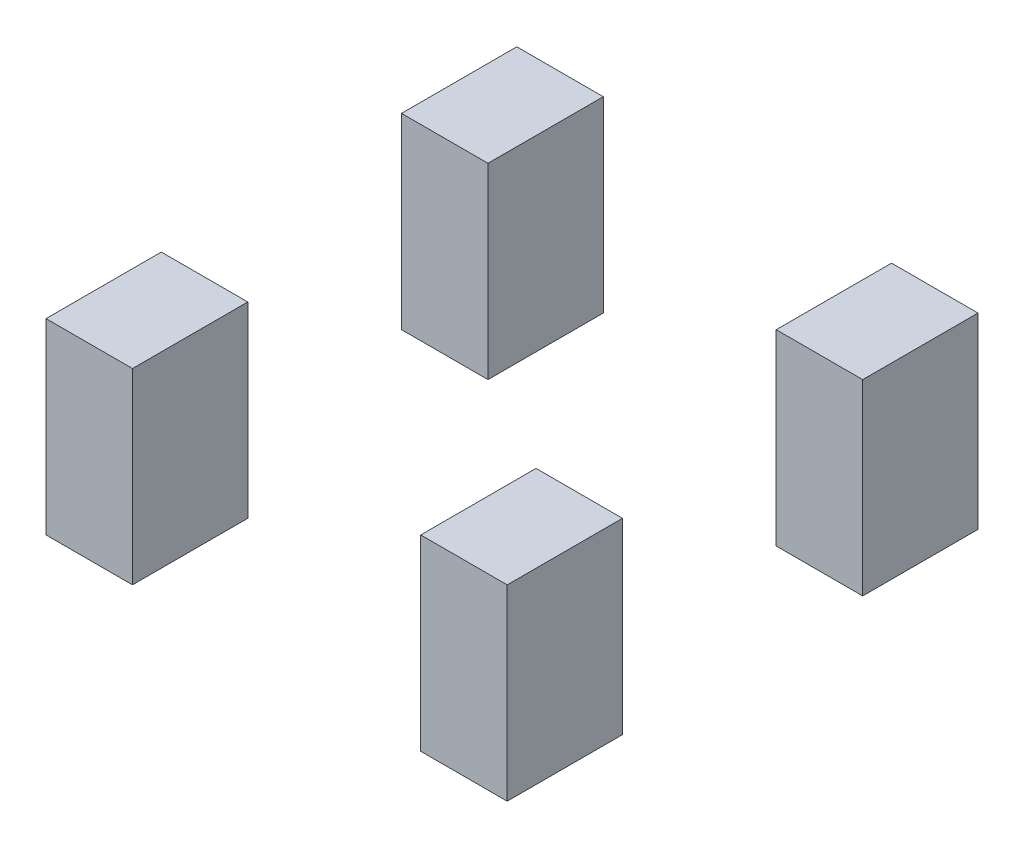
ISO-10303-21;
HEADER;
FILE_DESCRIPTION(('STEP AP214'),'2;1');
FILE_NAME('part.step','',(''),(''),'','','');
FILE_SCHEMA(('AUTOMOTIVE_DESIGN { 1 0 10303 214 1 1 1 1 }'));
ENDSEC;
DATA;
#1=APPLICATION_CONTEXT('core data for automotive mechanical design processes');
#2=APPLICATION_PROTOCOL_DEFINITION('international standard','automotive_design',2000,#1);
#3=PRODUCT_CONTEXT('',#1,'mechanical');
#4=PRODUCT('Part','Part','',(#3));
#5=PRODUCT_RELATED_PRODUCT_CATEGORY('part','',(#4));
#6=PRODUCT_DEFINITION_FORMATION('','',#4);
#7=PRODUCT_DEFINITION_CONTEXT('part definition',#1,'design');
#8=PRODUCT_DEFINITION('design','',#6,#7);
#9=PRODUCT_DEFINITION_SHAPE('','',#8);
#10=(LENGTH_UNIT() NAMED_UNIT(*) SI_UNIT(.MILLI.,.METRE.));
#11=(NAMED_UNIT(*) PLANE_ANGLE_UNIT() SI_UNIT($,.RADIAN.));
#12=(NAMED_UNIT(*) SI_UNIT($,.STERADIAN.) SOLID_ANGLE_UNIT());
#13=UNCERTAINTY_MEASURE_WITH_UNIT(LENGTH_MEASURE(1.E-05),#10,'distance_accuracy_value','');
#14=(GEOMETRIC_REPRESENTATION_CONTEXT(3) GLOBAL_UNCERTAINTY_ASSIGNED_CONTEXT((#13)) GLOBAL_UNIT_ASSIGNED_CONTEXT((#10,
#11,#12)) REPRESENTATION_CONTEXT('',''));
#15=CARTESIAN_POINT('',(0.,0.,0.));
#16=DIRECTION('',(0.,0.,1.));
#17=DIRECTION('',(1.,0.,0.));
#18=AXIS2_PLACEMENT_3D('',#15,#16,#17);
#19=CARTESIAN_POINT('',(-1234.81443298969,195.,5320.49405086318));
#20=DIRECTION('',(0.,0.,1.));
#21=DIRECTION('',(1.,0.,0.));
#22=AXIS2_PLACEMENT_3D('',#19,#20,#21);
#23=PLANE('',#22);
#24=DIRECTION('',(-1.,0.,0.));
#25=VECTOR('',#24,1.);
#26=CARTESIAN_POINT('',(-1234.81443298969,0.,5320.49405086318));
#27=LINE('',#26,#25);
#28=CARTESIAN_POINT('',(-1234.81443298969,0.,5320.49405086318));
#29=VERTEX_POINT('',#28);
#30=CARTESIAN_POINT('',(-1324.81443298969,0.,5320.49405086318));
#31=VERTEX_POINT('',#30);
#32=EDGE_CURVE('E108',#29,#31,#27,.T.);
#33=ORIENTED_EDGE('',*,*,#32,.T.);
#34=DIRECTION('',(0.,-1.,0.));
#35=VECTOR('',#34,1.);
#36=CARTESIAN_POINT('',(-1324.81443298969,195.,5320.49405086318));
#37=LINE('',#36,#35);
#38=CARTESIAN_POINT('',(-1324.81443298969,195.,5320.49405086318));
#39=VERTEX_POINT('',#38);
#40=EDGE_CURVE('E12',#39,#31,#37,.T.);
#41=ORIENTED_EDGE('',*,*,#40,.F.);
#42=DIRECTION('',(-1.,0.,0.));
#43=VECTOR('',#42,1.);
#44=CARTESIAN_POINT('',(-1234.81443298969,195.,5320.49405086318));
#45=LINE('',#44,#43);
#46=CARTESIAN_POINT('',(-1234.81443298969,195.,5320.49405086318));
#47=VERTEX_POINT('',#46);
#48=EDGE_CURVE('E96',#47,#39,#45,.T.);
#49=ORIENTED_EDGE('',*,*,#48,.F.);
#50=DIRECTION('',(0.,-1.,0.));
#51=VECTOR('',#50,1.);
#52=CARTESIAN_POINT('',(-1234.81443298969,195.,5320.49405086318));
#53=LINE('',#52,#51);
#54=EDGE_CURVE('E104',#47,#29,#53,.T.);
#55=ORIENTED_EDGE('',*,*,#54,.T.);
#56=EDGE_LOOP('',(#33,#41,#49,#55));
#57=FACE_BOUND('',#56,.T.);
#58=ADVANCED_FACE('F45',(#57),#23,.F.);
#59=CARTESIAN_POINT('',(-1324.81443298969,195.,5320.49405086318));
#60=DIRECTION('',(1.,0.,0.));
#61=DIRECTION('',(0.,0.,-1.));
#62=AXIS2_PLACEMENT_3D('',#59,#60,#61);
#63=PLANE('',#62);
#64=DIRECTION('',(0.,0.,1.));
#65=VECTOR('',#64,1.);
#66=CARTESIAN_POINT('',(-1324.81443298969,0.,5320.49405086318));
#67=LINE('',#66,#65);
#68=CARTESIAN_POINT('',(-1324.81443298969,0.,5440.49405086318));
#69=VERTEX_POINT('',#68);
#70=EDGE_CURVE('E100',#31,#69,#67,.T.);
#71=ORIENTED_EDGE('',*,*,#70,.T.);
#72=DIRECTION('',(0.,-1.,0.));
#73=VECTOR('',#72,1.);
#74=CARTESIAN_POINT('',(-1324.81443298969,195.,5440.49405086318));
#75=LINE('',#74,#73);
#76=CARTESIAN_POINT('',(-1324.81443298969,195.,5440.49405086318));
#77=VERTEX_POINT('',#76);
#78=EDGE_CURVE('E53',#77,#69,#75,.T.);
#79=ORIENTED_EDGE('',*,*,#78,.F.);
#80=DIRECTION('',(0.,0.,1.));
#81=VECTOR('',#80,1.);
#82=CARTESIAN_POINT('',(-1324.81443298969,195.,5320.49405086318));
#83=LINE('',#82,#81);
#84=EDGE_CURVE('E91',#39,#77,#83,.T.);
#85=ORIENTED_EDGE('',*,*,#84,.F.);
#86=ORIENTED_EDGE('',*,*,#40,.T.);
#87=EDGE_LOOP('',(#71,#79,#85,#86));
#88=FACE_BOUND('',#87,.T.);
#89=ADVANCED_FACE('F99',(#88),#63,.F.);
#90=CARTESIAN_POINT('',(-1234.81443298969,195.,5440.49405086318));
#91=DIRECTION('',(0.,0.,-1.));
#92=DIRECTION('',(-1.,0.,0.));
#93=AXIS2_PLACEMENT_3D('',#90,#91,#92);
#94=PLANE('',#93);
#95=DIRECTION('',(1.,0.,0.));
#96=VECTOR('',#95,1.);
#97=CARTESIAN_POINT('',(-1234.81443298969,0.,5440.49405086318));
#98=LINE('',#97,#96);
#99=CARTESIAN_POINT('',(-1234.81443298969,0.,5440.49405086318));
#100=VERTEX_POINT('',#99);
#101=EDGE_CURVE('E78',#69,#100,#98,.T.);
#102=ORIENTED_EDGE('',*,*,#101,.T.);
#103=DIRECTION('',(0.,-1.,0.));
#104=VECTOR('',#103,1.);
#105=CARTESIAN_POINT('',(-1234.81443298969,195.,5440.49405086318));
#106=LINE('',#105,#104);
#107=CARTESIAN_POINT('',(-1234.81443298969,195.,5440.49405086318));
#108=VERTEX_POINT('',#107);
#109=EDGE_CURVE('E101',#108,#100,#106,.T.);
#110=ORIENTED_EDGE('',*,*,#109,.F.);
#111=DIRECTION('',(1.,0.,0.));
#112=VECTOR('',#111,1.);
#113=CARTESIAN_POINT('',(-1234.81443298969,195.,5440.49405086318));
#114=LINE('',#113,#112);
#115=EDGE_CURVE('E94',#77,#108,#114,.T.);
#116=ORIENTED_EDGE('',*,*,#115,.F.);
#117=ORIENTED_EDGE('',*,*,#78,.T.);
#118=EDGE_LOOP('',(#102,#110,#116,#117));
#119=FACE_BOUND('',#118,.T.);
#120=ADVANCED_FACE('F102',(#119),#94,.F.);
#121=CARTESIAN_POINT('',(-1234.81443298969,195.,5320.49405086318));
#122=DIRECTION('',(-1.,0.,0.));
#123=DIRECTION('',(0.,0.,1.));
#124=AXIS2_PLACEMENT_3D('',#121,#122,#123);
#125=PLANE('',#124);
#126=DIRECTION('',(0.,0.,-1.));
#127=VECTOR('',#126,1.);
#128=CARTESIAN_POINT('',(-1234.81443298969,0.,5320.49405086318));
#129=LINE('',#128,#127);
#130=EDGE_CURVE('E84',#100,#29,#129,.T.);
#131=ORIENTED_EDGE('',*,*,#130,.T.);
#132=ORIENTED_EDGE('',*,*,#54,.F.);
#133=DIRECTION('',(0.,0.,-1.));
#134=VECTOR('',#133,1.);
#135=CARTESIAN_POINT('',(-1234.81443298969,195.,5320.49405086318));
#136=LINE('',#135,#134);
#137=EDGE_CURVE('E61',#108,#47,#136,.T.);
#138=ORIENTED_EDGE('',*,*,#137,.F.);
#139=ORIENTED_EDGE('',*,*,#109,.T.);
#140=EDGE_LOOP('',(#131,#132,#138,#139));
#141=FACE_BOUND('',#140,.T.);
#142=ADVANCED_FACE('F115',(#141),#125,.F.);
#143=CARTESIAN_POINT('',(0.,195.,0.));
#144=DIRECTION('',(0.,1.,0.));
#145=DIRECTION('',(0.,0.,1.));
#146=AXIS2_PLACEMENT_3D('',#143,#144,#145);
#147=PLANE('',#146);
#148=ORIENTED_EDGE('',*,*,#48,.T.);
#149=ORIENTED_EDGE('',*,*,#84,.T.);
#150=ORIENTED_EDGE('',*,*,#115,.T.);
#151=ORIENTED_EDGE('',*,*,#137,.T.);
#152=EDGE_LOOP('',(#148,#149,#150,#151));
#153=FACE_BOUND('',#152,.T.);
#154=ADVANCED_FACE('F92',(#153),#147,.T.);
#155=CARTESIAN_POINT('',(0.,0.,0.));
#156=DIRECTION('',(0.,1.,0.));
#157=DIRECTION('',(0.,0.,1.));
#158=AXIS2_PLACEMENT_3D('',#155,#156,#157);
#159=PLANE('',#158);
#160=ORIENTED_EDGE('',*,*,#32,.F.);
#161=ORIENTED_EDGE('',*,*,#130,.F.);
#162=ORIENTED_EDGE('',*,*,#101,.F.);
#163=ORIENTED_EDGE('',*,*,#70,.F.);
#164=EDGE_LOOP('',(#160,#161,#162,#163));
#165=FACE_BOUND('',#164,.T.);
#166=ADVANCED_FACE('F118',(#165),#159,.F.);
#167=CLOSED_SHELL('',(#58,#89,#120,#142,#154,#166));
#168=MANIFOLD_SOLID_BREP('B2',#167);
#169=CARTESIAN_POINT('',(-1234.81443298969,195.,5070.49405086318));
#170=DIRECTION('',(-1.,0.,0.));
#171=DIRECTION('',(0.,0.,1.));
#172=AXIS2_PLACEMENT_3D('',#169,#170,#171);
#173=PLANE('',#172);
#174=DIRECTION('',(0.,0.,-1.));
#175=VECTOR('',#174,1.);
#176=CARTESIAN_POINT('',(-1234.81443298969,0.,5070.49405086318));
#177=LINE('',#176,#175);
#178=CARTESIAN_POINT('',(-1234.81443298969,0.,5070.49405086318));
#179=VERTEX_POINT('',#178);
#180=CARTESIAN_POINT('',(-1234.81443298969,0.,4950.49405086318));
#181=VERTEX_POINT('',#180);
#182=EDGE_CURVE('E241',#179,#181,#177,.T.);
#183=ORIENTED_EDGE('',*,*,#182,.T.);
#184=DIRECTION('',(0.,-1.,0.));
#185=VECTOR('',#184,1.);
#186=CARTESIAN_POINT('',(-1234.81443298969,195.,4950.49405086318));
#187=LINE('',#186,#185);
#188=CARTESIAN_POINT('',(-1234.81443298969,195.,4950.49405086318));
#189=VERTEX_POINT('',#188);
#190=EDGE_CURVE('E43',#189,#181,#187,.T.);
#191=ORIENTED_EDGE('',*,*,#190,.F.);
#192=DIRECTION('',(0.,0.,-1.));
#193=VECTOR('',#192,1.);
#194=CARTESIAN_POINT('',(-1234.81443298969,195.,5070.49405086318));
#195=LINE('',#194,#193);
#196=CARTESIAN_POINT('',(-1234.81443298969,195.,5070.49405086318));
#197=VERTEX_POINT('',#196);
#198=EDGE_CURVE('E229',#197,#189,#195,.T.);
#199=ORIENTED_EDGE('',*,*,#198,.F.);
#200=DIRECTION('',(0.,-1.,0.));
#201=VECTOR('',#200,1.);
#202=CARTESIAN_POINT('',(-1234.81443298969,195.,5070.49405086318));
#203=LINE('',#202,#201);
#204=EDGE_CURVE('E237',#197,#179,#203,.T.);
#205=ORIENTED_EDGE('',*,*,#204,.T.);
#206=EDGE_LOOP('',(#183,#191,#199,#205));
#207=FACE_BOUND('',#206,.T.);
#208=ADVANCED_FACE('F178',(#207),#173,.F.);
#209=CARTESIAN_POINT('',(-1234.81443298969,195.,4950.49405086318));
#210=DIRECTION('',(0.,0.,1.));
#211=DIRECTION('',(1.,0.,0.));
#212=AXIS2_PLACEMENT_3D('',#209,#210,#211);
#213=PLANE('',#212);
#214=DIRECTION('',(-1.,0.,0.));
#215=VECTOR('',#214,1.);
#216=CARTESIAN_POINT('',(-1234.81443298969,0.,4950.49405086318));
#217=LINE('',#216,#215);
#218=CARTESIAN_POINT('',(-1324.81443298969,0.,4950.49405086318));
#219=VERTEX_POINT('',#218);
#220=EDGE_CURVE('E233',#181,#219,#217,.T.);
#221=ORIENTED_EDGE('',*,*,#220,.T.);
#222=DIRECTION('',(0.,-1.,0.));
#223=VECTOR('',#222,1.);
#224=CARTESIAN_POINT('',(-1324.81443298969,195.,4950.49405086318));
#225=LINE('',#224,#223);
#226=CARTESIAN_POINT('',(-1324.81443298969,195.,4950.49405086318));
#227=VERTEX_POINT('',#226);
#228=EDGE_CURVE('E186',#227,#219,#225,.T.);
#229=ORIENTED_EDGE('',*,*,#228,.F.);
#230=DIRECTION('',(-1.,0.,0.));
#231=VECTOR('',#230,1.);
#232=CARTESIAN_POINT('',(-1234.81443298969,195.,4950.49405086318));
#233=LINE('',#232,#231);
#234=EDGE_CURVE('E224',#189,#227,#233,.T.);
#235=ORIENTED_EDGE('',*,*,#234,.F.);
#236=ORIENTED_EDGE('',*,*,#190,.T.);
#237=EDGE_LOOP('',(#221,#229,#235,#236));
#238=FACE_BOUND('',#237,.T.);
#239=ADVANCED_FACE('F232',(#238),#213,.F.);
#240=CARTESIAN_POINT('',(-1324.81443298969,195.,5070.49405086318));
#241=DIRECTION('',(1.,0.,0.));
#242=DIRECTION('',(0.,0.,-1.));
#243=AXIS2_PLACEMENT_3D('',#240,#241,#242);
#244=PLANE('',#243);
#245=DIRECTION('',(0.,0.,1.));
#246=VECTOR('',#245,1.);
#247=CARTESIAN_POINT('',(-1324.81443298969,0.,5070.49405086318));
#248=LINE('',#247,#246);
#249=CARTESIAN_POINT('',(-1324.81443298969,0.,5070.49405086318));
#250=VERTEX_POINT('',#249);
#251=EDGE_CURVE('E211',#219,#250,#248,.T.);
#252=ORIENTED_EDGE('',*,*,#251,.T.);
#253=DIRECTION('',(0.,-1.,0.));
#254=VECTOR('',#253,1.);
#255=CARTESIAN_POINT('',(-1324.81443298969,195.,5070.49405086318));
#256=LINE('',#255,#254);
#257=CARTESIAN_POINT('',(-1324.81443298969,195.,5070.49405086318));
#258=VERTEX_POINT('',#257);
#259=EDGE_CURVE('E234',#258,#250,#256,.T.);
#260=ORIENTED_EDGE('',*,*,#259,.F.);
#261=DIRECTION('',(0.,0.,1.));
#262=VECTOR('',#261,1.);
#263=CARTESIAN_POINT('',(-1324.81443298969,195.,5070.49405086318));
#264=LINE('',#263,#262);
#265=EDGE_CURVE('E227',#227,#258,#264,.T.);
#266=ORIENTED_EDGE('',*,*,#265,.F.);
#267=ORIENTED_EDGE('',*,*,#228,.T.);
#268=EDGE_LOOP('',(#252,#260,#266,#267));
#269=FACE_BOUND('',#268,.T.);
#270=ADVANCED_FACE('F235',(#269),#244,.F.);
#271=CARTESIAN_POINT('',(-1234.81443298969,195.,5070.49405086318));
#272=DIRECTION('',(0.,0.,-1.));
#273=DIRECTION('',(-1.,0.,0.));
#274=AXIS2_PLACEMENT_3D('',#271,#272,#273);
#275=PLANE('',#274);
#276=DIRECTION('',(1.,0.,0.));
#277=VECTOR('',#276,1.);
#278=CARTESIAN_POINT('',(-1234.81443298969,0.,5070.49405086318));
#279=LINE('',#278,#277);
#280=EDGE_CURVE('E217',#250,#179,#279,.T.);
#281=ORIENTED_EDGE('',*,*,#280,.T.);
#282=ORIENTED_EDGE('',*,*,#204,.F.);
#283=DIRECTION('',(1.,0.,0.));
#284=VECTOR('',#283,1.);
#285=CARTESIAN_POINT('',(-1234.81443298969,195.,5070.49405086318));
#286=LINE('',#285,#284);
#287=EDGE_CURVE('E194',#258,#197,#286,.T.);
#288=ORIENTED_EDGE('',*,*,#287,.F.);
#289=ORIENTED_EDGE('',*,*,#259,.T.);
#290=EDGE_LOOP('',(#281,#282,#288,#289));
#291=FACE_BOUND('',#290,.T.);
#292=ADVANCED_FACE('F248',(#291),#275,.F.);
#293=CARTESIAN_POINT('',(0.,195.,0.));
#294=DIRECTION('',(0.,1.,0.));
#295=DIRECTION('',(0.,0.,1.));
#296=AXIS2_PLACEMENT_3D('',#293,#294,#295);
#297=PLANE('',#296);
#298=ORIENTED_EDGE('',*,*,#198,.T.);
#299=ORIENTED_EDGE('',*,*,#234,.T.);
#300=ORIENTED_EDGE('',*,*,#265,.T.);
#301=ORIENTED_EDGE('',*,*,#287,.T.);
#302=EDGE_LOOP('',(#298,#299,#300,#301));
#303=FACE_BOUND('',#302,.T.);
#304=ADVANCED_FACE('F225',(#303),#297,.T.);
#305=CARTESIAN_POINT('',(0.,0.,0.));
#306=DIRECTION('',(0.,1.,0.));
#307=DIRECTION('',(0.,0.,1.));
#308=AXIS2_PLACEMENT_3D('',#305,#306,#307);
#309=PLANE('',#308);
#310=ORIENTED_EDGE('',*,*,#182,.F.);
#311=ORIENTED_EDGE('',*,*,#280,.F.);
#312=ORIENTED_EDGE('',*,*,#251,.F.);
#313=ORIENTED_EDGE('',*,*,#220,.F.);
#314=EDGE_LOOP('',(#310,#311,#312,#313));
#315=FACE_BOUND('',#314,.T.);
#316=ADVANCED_FACE('F251',(#315),#309,.F.);
#317=CLOSED_SHELL('',(#208,#239,#270,#292,#304,#316));
#318=MANIFOLD_SOLID_BREP('B6',#317);
#319=CARTESIAN_POINT('',(-1714.81443298969,195.,5320.49405086318));
#320=DIRECTION('',(1.,0.,0.));
#321=DIRECTION('',(0.,0.,-1.));
#322=AXIS2_PLACEMENT_3D('',#319,#320,#321);
#323=PLANE('',#322);
#324=DIRECTION('',(0.,0.,1.));
#325=VECTOR('',#324,1.);
#326=CARTESIAN_POINT('',(-1714.81443298969,0.,5320.49405086318));
#327=LINE('',#326,#325);
#328=CARTESIAN_POINT('',(-1714.81443298969,0.,5320.49405086318));
#329=VERTEX_POINT('',#328);
#330=CARTESIAN_POINT('',(-1714.81443298969,0.,5440.49405086318));
#331=VERTEX_POINT('',#330);
#332=EDGE_CURVE('E373',#329,#331,#327,.T.);
#333=ORIENTED_EDGE('',*,*,#332,.T.);
#334=DIRECTION('',(0.,-1.,0.));
#335=VECTOR('',#334,1.);
#336=CARTESIAN_POINT('',(-1714.81443298969,195.,5440.49405086318));
#337=LINE('',#336,#335);
#338=CARTESIAN_POINT('',(-1714.81443298969,195.,5440.49405086318));
#339=VERTEX_POINT('',#338);
#340=EDGE_CURVE('E176',#339,#331,#337,.T.);
#341=ORIENTED_EDGE('',*,*,#340,.F.);
#342=DIRECTION('',(0.,0.,1.));
#343=VECTOR('',#342,1.);
#344=CARTESIAN_POINT('',(-1714.81443298969,195.,5320.49405086318));
#345=LINE('',#344,#343);
#346=CARTESIAN_POINT('',(-1714.81443298969,195.,5320.49405086318));
#347=VERTEX_POINT('',#346);
#348=EDGE_CURVE('E361',#347,#339,#345,.T.);
#349=ORIENTED_EDGE('',*,*,#348,.F.);
#350=DIRECTION('',(0.,-1.,0.));
#351=VECTOR('',#350,1.);
#352=CARTESIAN_POINT('',(-1714.81443298969,195.,5320.49405086318));
#353=LINE('',#352,#351);
#354=EDGE_CURVE('E369',#347,#329,#353,.T.);
#355=ORIENTED_EDGE('',*,*,#354,.T.);
#356=EDGE_LOOP('',(#333,#341,#349,#355));
#357=FACE_BOUND('',#356,.T.);
#358=ADVANCED_FACE('F310',(#357),#323,.F.);
#359=CARTESIAN_POINT('',(-1714.81443298969,195.,5440.49405086318));
#360=DIRECTION('',(0.,0.,-1.));
#361=DIRECTION('',(-1.,0.,0.));
#362=AXIS2_PLACEMENT_3D('',#359,#360,#361);
#363=PLANE('',#362);
#364=DIRECTION('',(1.,0.,0.));
#365=VECTOR('',#364,1.);
#366=CARTESIAN_POINT('',(-1714.81443298969,0.,5440.49405086318));
#367=LINE('',#366,#365);
#368=CARTESIAN_POINT('',(-1624.81443298969,0.,5440.49405086318));
#369=VERTEX_POINT('',#368);
#370=EDGE_CURVE('E365',#331,#369,#367,.T.);
#371=ORIENTED_EDGE('',*,*,#370,.T.);
#372=DIRECTION('',(0.,-1.,0.));
#373=VECTOR('',#372,1.);
#374=CARTESIAN_POINT('',(-1624.81443298969,195.,5440.49405086318));
#375=LINE('',#374,#373);
#376=CARTESIAN_POINT('',(-1624.81443298969,195.,5440.49405086318));
#377=VERTEX_POINT('',#376);
#378=EDGE_CURVE('E318',#377,#369,#375,.T.);
#379=ORIENTED_EDGE('',*,*,#378,.F.);
#380=DIRECTION('',(1.,0.,0.));
#381=VECTOR('',#380,1.);
#382=CARTESIAN_POINT('',(-1714.81443298969,195.,5440.49405086318));
#383=LINE('',#382,#381);
#384=EDGE_CURVE('E356',#339,#377,#383,.T.);
#385=ORIENTED_EDGE('',*,*,#384,.F.);
#386=ORIENTED_EDGE('',*,*,#340,.T.);
#387=EDGE_LOOP('',(#371,#379,#385,#386));
#388=FACE_BOUND('',#387,.T.);
#389=ADVANCED_FACE('F364',(#388),#363,.F.);
#390=CARTESIAN_POINT('',(-1624.81443298969,195.,5320.49405086318));
#391=DIRECTION('',(-1.,0.,0.));
#392=DIRECTION('',(0.,0.,1.));
#393=AXIS2_PLACEMENT_3D('',#390,#391,#392);
#394=PLANE('',#393);
#395=DIRECTION('',(0.,0.,-1.));
#396=VECTOR('',#395,1.);
#397=CARTESIAN_POINT('',(-1624.81443298969,0.,5320.49405086318));
#398=LINE('',#397,#396);
#399=CARTESIAN_POINT('',(-1624.81443298969,0.,5320.49405086318));
#400=VERTEX_POINT('',#399);
#401=EDGE_CURVE('E343',#369,#400,#398,.T.);
#402=ORIENTED_EDGE('',*,*,#401,.T.);
#403=DIRECTION('',(0.,-1.,0.));
#404=VECTOR('',#403,1.);
#405=CARTESIAN_POINT('',(-1624.81443298969,195.,5320.49405086318));
#406=LINE('',#405,#404);
#407=CARTESIAN_POINT('',(-1624.81443298969,195.,5320.49405086318));
#408=VERTEX_POINT('',#407);
#409=EDGE_CURVE('E366',#408,#400,#406,.T.);
#410=ORIENTED_EDGE('',*,*,#409,.F.);
#411=DIRECTION('',(0.,0.,-1.));
#412=VECTOR('',#411,1.);
#413=CARTESIAN_POINT('',(-1624.81443298969,195.,5320.49405086318));
#414=LINE('',#413,#412);
#415=EDGE_CURVE('E359',#377,#408,#414,.T.);
#416=ORIENTED_EDGE('',*,*,#415,.F.);
#417=ORIENTED_EDGE('',*,*,#378,.T.);
#418=EDGE_LOOP('',(#402,#410,#416,#417));
#419=FACE_BOUND('',#418,.T.);
#420=ADVANCED_FACE('F367',(#419),#394,.F.);
#421=CARTESIAN_POINT('',(-1714.81443298969,195.,5320.49405086318));
#422=DIRECTION('',(0.,0.,1.));
#423=DIRECTION('',(1.,0.,0.));
#424=AXIS2_PLACEMENT_3D('',#421,#422,#423);
#425=PLANE('',#424);
#426=DIRECTION('',(-1.,0.,0.));
#427=VECTOR('',#426,1.);
#428=CARTESIAN_POINT('',(-1714.81443298969,0.,5320.49405086318));
#429=LINE('',#428,#427);
#430=EDGE_CURVE('E349',#400,#329,#429,.T.);
#431=ORIENTED_EDGE('',*,*,#430,.T.);
#432=ORIENTED_EDGE('',*,*,#354,.F.);
#433=DIRECTION('',(-1.,0.,0.));
#434=VECTOR('',#433,1.);
#435=CARTESIAN_POINT('',(-1714.81443298969,195.,5320.49405086318));
#436=LINE('',#435,#434);
#437=EDGE_CURVE('E326',#408,#347,#436,.T.);
#438=ORIENTED_EDGE('',*,*,#437,.F.);
#439=ORIENTED_EDGE('',*,*,#409,.T.);
#440=EDGE_LOOP('',(#431,#432,#438,#439));
#441=FACE_BOUND('',#440,.T.);
#442=ADVANCED_FACE('F380',(#441),#425,.F.);
#443=CARTESIAN_POINT('',(0.,195.,0.));
#444=DIRECTION('',(0.,1.,0.));
#445=DIRECTION('',(0.,0.,1.));
#446=AXIS2_PLACEMENT_3D('',#443,#444,#445);
#447=PLANE('',#446);
#448=ORIENTED_EDGE('',*,*,#348,.T.);
#449=ORIENTED_EDGE('',*,*,#384,.T.);
#450=ORIENTED_EDGE('',*,*,#415,.T.);
#451=ORIENTED_EDGE('',*,*,#437,.T.);
#452=EDGE_LOOP('',(#448,#449,#450,#451));
#453=FACE_BOUND('',#452,.T.);
#454=ADVANCED_FACE('F357',(#453),#447,.T.);
#455=CARTESIAN_POINT('',(0.,0.,0.));
#456=DIRECTION('',(0.,1.,0.));
#457=DIRECTION('',(0.,0.,1.));
#458=AXIS2_PLACEMENT_3D('',#455,#456,#457);
#459=PLANE('',#458);
#460=ORIENTED_EDGE('',*,*,#332,.F.);
#461=ORIENTED_EDGE('',*,*,#430,.F.);
#462=ORIENTED_EDGE('',*,*,#401,.F.);
#463=ORIENTED_EDGE('',*,*,#370,.F.);
#464=EDGE_LOOP('',(#460,#461,#462,#463));
#465=FACE_BOUND('',#464,.T.);
#466=ADVANCED_FACE('F383',(#465),#459,.F.);
#467=CLOSED_SHELL('',(#358,#389,#420,#442,#454,#466));
#468=MANIFOLD_SOLID_BREP('B37',#467);
#469=CARTESIAN_POINT('',(-1714.81443298969,195.,5070.49405086318));
#470=DIRECTION('',(0.,0.,-1.));
#471=DIRECTION('',(-1.,0.,0.));
#472=AXIS2_PLACEMENT_3D('',#469,#470,#471);
#473=PLANE('',#472);
#474=DIRECTION('',(1.,0.,0.));
#475=VECTOR('',#474,1.);
#476=CARTESIAN_POINT('',(-1714.81443298969,0.,5070.49405086318));
#477=LINE('',#476,#475);
#478=CARTESIAN_POINT('',(-1714.81443298969,0.,5070.49405086318));
#479=VERTEX_POINT('',#478);
#480=CARTESIAN_POINT('',(-1624.81443298969,0.,5070.49405086318));
#481=VERTEX_POINT('',#480);
#482=EDGE_CURVE('E496',#479,#481,#477,.T.);
#483=ORIENTED_EDGE('',*,*,#482,.T.);
#484=DIRECTION('',(0.,-1.,0.));
#485=VECTOR('',#484,1.);
#486=CARTESIAN_POINT('',(-1624.81443298969,195.,5070.49405086318));
#487=LINE('',#486,#485);
#488=CARTESIAN_POINT('',(-1624.81443298969,195.,5070.49405086318));
#489=VERTEX_POINT('',#488);
#490=EDGE_CURVE('E308',#489,#481,#487,.T.);
#491=ORIENTED_EDGE('',*,*,#490,.F.);
#492=DIRECTION('',(1.,0.,0.));
#493=VECTOR('',#492,1.);
#494=CARTESIAN_POINT('',(-1714.81443298969,195.,5070.49405086318));
#495=LINE('',#494,#493);
#496=CARTESIAN_POINT('',(-1714.81443298969,195.,5070.49405086318));
#497=VERTEX_POINT('',#496);
#498=EDGE_CURVE('E484',#497,#489,#495,.T.);
#499=ORIENTED_EDGE('',*,*,#498,.F.);
#500=DIRECTION('',(0.,-1.,0.));
#501=VECTOR('',#500,1.);
#502=CARTESIAN_POINT('',(-1714.81443298969,195.,5070.49405086318));
#503=LINE('',#502,#501);
#504=EDGE_CURVE('E492',#497,#479,#503,.T.);
#505=ORIENTED_EDGE('',*,*,#504,.T.);
#506=EDGE_LOOP('',(#483,#491,#499,#505));
#507=FACE_BOUND('',#506,.T.);
#508=ADVANCED_FACE('F433',(#507),#473,.F.);
#509=CARTESIAN_POINT('',(-1624.81443298969,195.,5070.49405086318));
#510=DIRECTION('',(-1.,0.,0.));
#511=DIRECTION('',(0.,0.,1.));
#512=AXIS2_PLACEMENT_3D('',#509,#510,#511);
#513=PLANE('',#512);
#514=DIRECTION('',(0.,0.,-1.));
#515=VECTOR('',#514,1.);
#516=CARTESIAN_POINT('',(-1624.81443298969,0.,5070.49405086318));
#517=LINE('',#516,#515);
#518=CARTESIAN_POINT('',(-1624.81443298969,0.,4950.49405086318));
#519=VERTEX_POINT('',#518);
#520=EDGE_CURVE('E488',#481,#519,#517,.T.);
#521=ORIENTED_EDGE('',*,*,#520,.T.);
#522=DIRECTION('',(0.,-1.,0.));
#523=VECTOR('',#522,1.);
#524=CARTESIAN_POINT('',(-1624.81443298969,195.,4950.49405086318));
#525=LINE('',#524,#523);
#526=CARTESIAN_POINT('',(-1624.81443298969,195.,4950.49405086318));
#527=VERTEX_POINT('',#526);
#528=EDGE_CURVE('E441',#527,#519,#525,.T.);
#529=ORIENTED_EDGE('',*,*,#528,.F.);
#530=DIRECTION('',(0.,0.,-1.));
#531=VECTOR('',#530,1.);
#532=CARTESIAN_POINT('',(-1624.81443298969,195.,5070.49405086318));
#533=LINE('',#532,#531);
#534=EDGE_CURVE('E479',#489,#527,#533,.T.);
#535=ORIENTED_EDGE('',*,*,#534,.F.);
#536=ORIENTED_EDGE('',*,*,#490,.T.);
#537=EDGE_LOOP('',(#521,#529,#535,#536));
#538=FACE_BOUND('',#537,.T.);
#539=ADVANCED_FACE('F487',(#538),#513,.F.);
#540=CARTESIAN_POINT('',(-1714.81443298969,195.,4950.49405086318));
#541=DIRECTION('',(0.,0.,1.));
#542=DIRECTION('',(1.,0.,0.));
#543=AXIS2_PLACEMENT_3D('',#540,#541,#542);
#544=PLANE('',#543);
#545=DIRECTION('',(-1.,0.,0.));
#546=VECTOR('',#545,1.);
#547=CARTESIAN_POINT('',(-1714.81443298969,0.,4950.49405086318));
#548=LINE('',#547,#546);
#549=CARTESIAN_POINT('',(-1714.81443298969,0.,4950.49405086318));
#550=VERTEX_POINT('',#549);
#551=EDGE_CURVE('E466',#519,#550,#548,.T.);
#552=ORIENTED_EDGE('',*,*,#551,.T.);
#553=DIRECTION('',(0.,-1.,0.));
#554=VECTOR('',#553,1.);
#555=CARTESIAN_POINT('',(-1714.81443298969,195.,4950.49405086318));
#556=LINE('',#555,#554);
#557=CARTESIAN_POINT('',(-1714.81443298969,195.,4950.49405086318));
#558=VERTEX_POINT('',#557);
#559=EDGE_CURVE('E489',#558,#550,#556,.T.);
#560=ORIENTED_EDGE('',*,*,#559,.F.);
#561=DIRECTION('',(-1.,0.,0.));
#562=VECTOR('',#561,1.);
#563=CARTESIAN_POINT('',(-1714.81443298969,195.,4950.49405086318));
#564=LINE('',#563,#562);
#565=EDGE_CURVE('E482',#527,#558,#564,.T.);
#566=ORIENTED_EDGE('',*,*,#565,.F.);
#567=ORIENTED_EDGE('',*,*,#528,.T.);
#568=EDGE_LOOP('',(#552,#560,#566,#567));
#569=FACE_BOUND('',#568,.T.);
#570=ADVANCED_FACE('F490',(#569),#544,.F.);
#571=CARTESIAN_POINT('',(-1714.81443298969,195.,5070.49405086318));
#572=DIRECTION('',(1.,0.,0.));
#573=DIRECTION('',(0.,0.,-1.));
#574=AXIS2_PLACEMENT_3D('',#571,#572,#573);
#575=PLANE('',#574);
#576=DIRECTION('',(0.,0.,1.));
#577=VECTOR('',#576,1.);
#578=CARTESIAN_POINT('',(-1714.81443298969,0.,5070.49405086318));
#579=LINE('',#578,#577);
#580=EDGE_CURVE('E472',#550,#479,#579,.T.);
#581=ORIENTED_EDGE('',*,*,#580,.T.);
#582=ORIENTED_EDGE('',*,*,#504,.F.);
#583=DIRECTION('',(0.,0.,1.));
#584=VECTOR('',#583,1.);
#585=CARTESIAN_POINT('',(-1714.81443298969,195.,5070.49405086318));
#586=LINE('',#585,#584);
#587=EDGE_CURVE('E449',#558,#497,#586,.T.);
#588=ORIENTED_EDGE('',*,*,#587,.F.);
#589=ORIENTED_EDGE('',*,*,#559,.T.);
#590=EDGE_LOOP('',(#581,#582,#588,#589));
#591=FACE_BOUND('',#590,.T.);
#592=ADVANCED_FACE('F503',(#591),#575,.F.);
#593=CARTESIAN_POINT('',(0.,195.,0.));
#594=DIRECTION('',(0.,1.,0.));
#595=DIRECTION('',(0.,0.,1.));
#596=AXIS2_PLACEMENT_3D('',#593,#594,#595);
#597=PLANE('',#596);
#598=ORIENTED_EDGE('',*,*,#498,.T.);
#599=ORIENTED_EDGE('',*,*,#534,.T.);
#600=ORIENTED_EDGE('',*,*,#565,.T.);
#601=ORIENTED_EDGE('',*,*,#587,.T.);
#602=EDGE_LOOP('',(#598,#599,#600,#601));
#603=FACE_BOUND('',#602,.T.);
#604=ADVANCED_FACE('F480',(#603),#597,.T.);
#605=CARTESIAN_POINT('',(0.,0.,0.));
#606=DIRECTION('',(0.,1.,0.));
#607=DIRECTION('',(0.,0.,1.));
#608=AXIS2_PLACEMENT_3D('',#605,#606,#607);
#609=PLANE('',#608);
#610=ORIENTED_EDGE('',*,*,#482,.F.);
#611=ORIENTED_EDGE('',*,*,#580,.F.);
#612=ORIENTED_EDGE('',*,*,#551,.F.);
#613=ORIENTED_EDGE('',*,*,#520,.F.);
#614=EDGE_LOOP('',(#610,#611,#612,#613));
#615=FACE_BOUND('',#614,.T.);
#616=ADVANCED_FACE('F506',(#615),#609,.F.);
#617=CLOSED_SHELL('',(#508,#539,#570,#592,#604,#616));
#618=MANIFOLD_SOLID_BREP('B170',#617);
#619=ADVANCED_BREP_SHAPE_REPRESENTATION('',(#18,#168,#318,#468,#618),#14);
#620=SHAPE_DEFINITION_REPRESENTATION(#9,#619);
ENDSEC;
END-ISO-10303-21;
